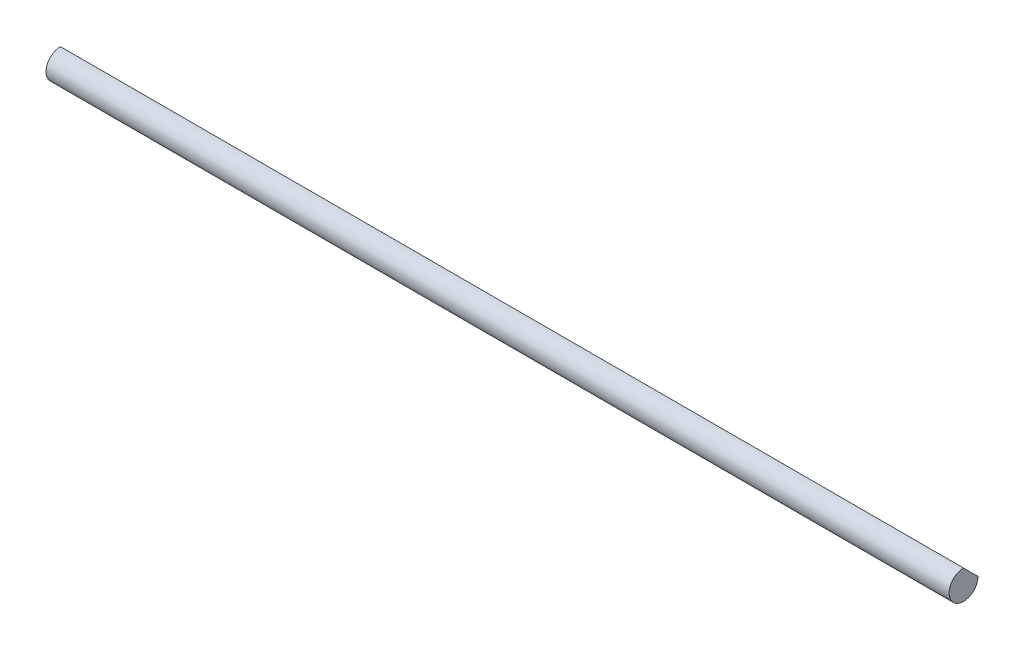
ISO-10303-21;
HEADER;
FILE_DESCRIPTION(('STEP AP214'),'2;1');
FILE_NAME('part.step','',(''),(''),'','','');
FILE_SCHEMA(('AUTOMOTIVE_DESIGN { 1 0 10303 214 1 1 1 1 }'));
ENDSEC;
DATA;
#1=APPLICATION_CONTEXT('core data for automotive mechanical design processes');
#2=APPLICATION_PROTOCOL_DEFINITION('international standard','automotive_design',2000,#1);
#3=PRODUCT_CONTEXT('',#1,'mechanical');
#4=PRODUCT('Part','Part','',(#3));
#5=PRODUCT_RELATED_PRODUCT_CATEGORY('part','',(#4));
#6=PRODUCT_DEFINITION_FORMATION('','',#4);
#7=PRODUCT_DEFINITION_CONTEXT('part definition',#1,'design');
#8=PRODUCT_DEFINITION('design','',#6,#7);
#9=PRODUCT_DEFINITION_SHAPE('','',#8);
#10=(LENGTH_UNIT() NAMED_UNIT(*) SI_UNIT(.MILLI.,.METRE.));
#11=(NAMED_UNIT(*) PLANE_ANGLE_UNIT() SI_UNIT($,.RADIAN.));
#12=(NAMED_UNIT(*) SI_UNIT($,.STERADIAN.) SOLID_ANGLE_UNIT());
#13=UNCERTAINTY_MEASURE_WITH_UNIT(LENGTH_MEASURE(1.E-05),#10,'distance_accuracy_value','');
#14=(GEOMETRIC_REPRESENTATION_CONTEXT(3) GLOBAL_UNCERTAINTY_ASSIGNED_CONTEXT((#13)) GLOBAL_UNIT_ASSIGNED_CONTEXT((#10,
#11,#12)) REPRESENTATION_CONTEXT('',''));
#15=CARTESIAN_POINT('',(0.,0.,0.));
#16=DIRECTION('',(0.,0.,1.));
#17=DIRECTION('',(1.,0.,0.));
#18=AXIS2_PLACEMENT_3D('',#15,#16,#17);
#19=CARTESIAN_POINT('',(125.,0.,0.));
#20=DIRECTION('',(-1.,0.,0.));
#21=DIRECTION('',(0.,0.,1.));
#22=AXIS2_PLACEMENT_3D('',#19,#20,#21);
#23=CYLINDRICAL_SURFACE('',#22,2.);
#24=CARTESIAN_POINT('',(0.,0.,0.));
#25=DIRECTION('',(1.,0.,0.));
#26=DIRECTION('',(0.,0.,-1.));
#27=AXIS2_PLACEMENT_3D('',#24,#25,#26);
#28=CIRCLE('',#27,2.);
#29=CARTESIAN_POINT('',(0.,2.,0.));
#30=VERTEX_POINT('',#29);
#31=CARTESIAN_POINT('',(0.,0.,-2.));
#32=VERTEX_POINT('',#31);
#33=EDGE_CURVE('E66',#30,#32,#28,.T.);
#34=ORIENTED_EDGE('',*,*,#33,.T.);
#35=DIRECTION('',(-1.,0.,0.));
#36=VECTOR('',#35,1.);
#37=CARTESIAN_POINT('',(125.,0.,-2.));
#38=LINE('',#37,#36);
#39=CARTESIAN_POINT('',(125.,0.,-2.));
#40=VERTEX_POINT('',#39);
#41=EDGE_CURVE('E11',#40,#32,#38,.T.);
#42=ORIENTED_EDGE('',*,*,#41,.F.);
#43=CARTESIAN_POINT('',(125.,0.,0.));
#44=DIRECTION('',(1.,0.,0.));
#45=DIRECTION('',(0.,0.,-1.));
#46=AXIS2_PLACEMENT_3D('',#43,#44,#45);
#47=CIRCLE('',#46,2.);
#48=CARTESIAN_POINT('',(125.,2.,0.));
#49=VERTEX_POINT('',#48);
#50=EDGE_CURVE('E65',#49,#40,#47,.T.);
#51=ORIENTED_EDGE('',*,*,#50,.F.);
#52=DIRECTION('',(-1.,0.,0.));
#53=VECTOR('',#52,1.);
#54=CARTESIAN_POINT('',(125.,2.,0.));
#55=LINE('',#54,#53);
#56=EDGE_CURVE('E43',#49,#30,#55,.T.);
#57=ORIENTED_EDGE('',*,*,#56,.T.);
#58=EDGE_LOOP('',(#34,#42,#51,#57));
#59=FACE_BOUND('',#58,.T.);
#60=ADVANCED_FACE('F35',(#59),#23,.T.);
#61=CARTESIAN_POINT('',(125.,2.,0.));
#62=DIRECTION('',(0.,-0.707106781186548,0.707106781186548));
#63=DIRECTION('',(0.,-0.707106781186548,-0.707106781186548));
#64=AXIS2_PLACEMENT_3D('',#61,#62,#63);
#65=PLANE('',#64);
#66=DIRECTION('',(0.,0.707106781186548,0.707106781186548));
#67=VECTOR('',#66,1.);
#68=CARTESIAN_POINT('',(0.,2.,0.));
#69=LINE('',#68,#67);
#70=EDGE_CURVE('E58',#32,#30,#69,.T.);
#71=ORIENTED_EDGE('',*,*,#70,.T.);
#72=ORIENTED_EDGE('',*,*,#56,.F.);
#73=DIRECTION('',(0.,0.707106781186548,0.707106781186548));
#74=VECTOR('',#73,1.);
#75=CARTESIAN_POINT('',(125.,2.,0.));
#76=LINE('',#75,#74);
#77=EDGE_CURVE('E50',#40,#49,#76,.T.);
#78=ORIENTED_EDGE('',*,*,#77,.F.);
#79=ORIENTED_EDGE('',*,*,#41,.T.);
#80=EDGE_LOOP('',(#71,#72,#78,#79));
#81=FACE_BOUND('',#80,.T.);
#82=ADVANCED_FACE('F61',(#81),#65,.F.);
#83=CARTESIAN_POINT('',(125.,0.,0.));
#84=DIRECTION('',(1.,0.,0.));
#85=DIRECTION('',(0.,0.,-1.));
#86=AXIS2_PLACEMENT_3D('',#83,#84,#85);
#87=PLANE('',#86);
#88=ORIENTED_EDGE('',*,*,#50,.T.);
#89=ORIENTED_EDGE('',*,*,#77,.T.);
#90=EDGE_LOOP('',(#88,#89));
#91=FACE_BOUND('',#90,.T.);
#92=ADVANCED_FACE('F73',(#91),#87,.T.);
#93=CARTESIAN_POINT('',(0.,0.,0.));
#94=DIRECTION('',(1.,0.,0.));
#95=DIRECTION('',(0.,0.,-1.));
#96=AXIS2_PLACEMENT_3D('',#93,#94,#95);
#97=PLANE('',#96);
#98=ORIENTED_EDGE('',*,*,#33,.F.);
#99=ORIENTED_EDGE('',*,*,#70,.F.);
#100=EDGE_LOOP('',(#98,#99));
#101=FACE_BOUND('',#100,.T.);
#102=ADVANCED_FACE('F69',(#101),#97,.F.);
#103=CLOSED_SHELL('',(#60,#82,#92,#102));
#104=MANIFOLD_SOLID_BREP('B2',#103);
#105=ADVANCED_BREP_SHAPE_REPRESENTATION('',(#18,#104),#14);
#106=SHAPE_DEFINITION_REPRESENTATION(#9,#105);
ENDSEC;
END-ISO-10303-21;
